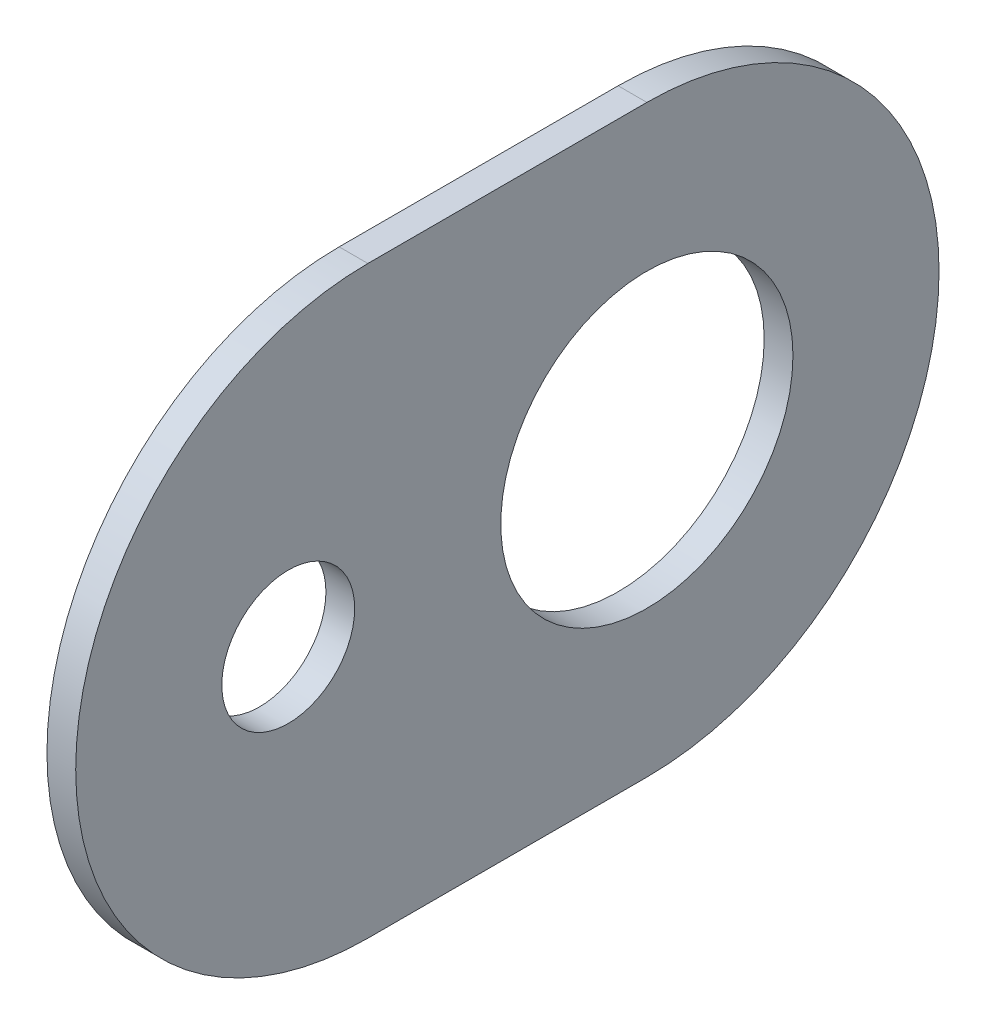
ISO-10303-21;
HEADER;
FILE_DESCRIPTION(('STEP AP214'),'2;1');
FILE_NAME('part.step','',(''),(''),'','','');
FILE_SCHEMA(('AUTOMOTIVE_DESIGN { 1 0 10303 214 1 1 1 1 }'));
ENDSEC;
DATA;
#1=APPLICATION_CONTEXT('core data for automotive mechanical design processes');
#2=APPLICATION_PROTOCOL_DEFINITION('international standard','automotive_design',2000,#1);
#3=PRODUCT_CONTEXT('',#1,'mechanical');
#4=PRODUCT('Part','Part','',(#3));
#5=PRODUCT_RELATED_PRODUCT_CATEGORY('part','',(#4));
#6=PRODUCT_DEFINITION_FORMATION('','',#4);
#7=PRODUCT_DEFINITION_CONTEXT('part definition',#1,'design');
#8=PRODUCT_DEFINITION('design','',#6,#7);
#9=PRODUCT_DEFINITION_SHAPE('','',#8);
#10=(LENGTH_UNIT() NAMED_UNIT(*) SI_UNIT(.MILLI.,.METRE.));
#11=(NAMED_UNIT(*) PLANE_ANGLE_UNIT() SI_UNIT($,.RADIAN.));
#12=(NAMED_UNIT(*) SI_UNIT($,.STERADIAN.) SOLID_ANGLE_UNIT());
#13=UNCERTAINTY_MEASURE_WITH_UNIT(LENGTH_MEASURE(1.E-05),#10,'distance_accuracy_value','');
#14=(GEOMETRIC_REPRESENTATION_CONTEXT(3) GLOBAL_UNCERTAINTY_ASSIGNED_CONTEXT((#13)) GLOBAL_UNIT_ASSIGNED_CONTEXT((#10,
#11,#12)) REPRESENTATION_CONTEXT('',''));
#15=CARTESIAN_POINT('',(0.,0.,0.));
#16=DIRECTION('',(0.,0.,1.));
#17=DIRECTION('',(1.,0.,0.));
#18=AXIS2_PLACEMENT_3D('',#15,#16,#17);
#19=CARTESIAN_POINT('',(2.5,25.3999999365,0.));
#20=DIRECTION('',(0.,-1.,0.));
#21=DIRECTION('',(0.,0.,-1.));
#22=AXIS2_PLACEMENT_3D('',#19,#20,#21);
#23=PLANE('',#22);
#24=DIRECTION('',(0.,0.,1.));
#25=VECTOR('',#24,1.);
#26=CARTESIAN_POINT('',(0.,25.3999999365,0.));
#27=LINE('',#26,#25);
#28=CARTESIAN_POINT('',(0.,25.3999999365,-12.12597266825));
#29=VERTEX_POINT('',#28);
#30=CARTESIAN_POINT('',(0.,25.3999999365,12.12597266825));
#31=VERTEX_POINT('',#30);
#32=EDGE_CURVE('E120',#29,#31,#27,.T.);
#33=ORIENTED_EDGE('',*,*,#32,.T.);
#34=DIRECTION('',(-1.,0.,0.));
#35=VECTOR('',#34,1.);
#36=CARTESIAN_POINT('',(2.5,25.3999999365,12.12597266825));
#37=LINE('',#36,#35);
#38=CARTESIAN_POINT('',(2.5,25.3999999365,12.12597266825));
#39=VERTEX_POINT('',#38);
#40=EDGE_CURVE('E12',#39,#31,#37,.T.);
#41=ORIENTED_EDGE('',*,*,#40,.F.);
#42=DIRECTION('',(0.,0.,1.));
#43=VECTOR('',#42,1.);
#44=CARTESIAN_POINT('',(2.5,25.3999999365,0.));
#45=LINE('',#44,#43);
#46=CARTESIAN_POINT('',(2.5,25.3999999365,-12.12597266825));
#47=VERTEX_POINT('',#46);
#48=EDGE_CURVE('E97',#47,#39,#45,.T.);
#49=ORIENTED_EDGE('',*,*,#48,.F.);
#50=DIRECTION('',(-1.,0.,0.));
#51=VECTOR('',#50,1.);
#52=CARTESIAN_POINT('',(2.5,25.3999999365,-12.12597266825));
#53=LINE('',#52,#51);
#54=EDGE_CURVE('E108',#47,#29,#53,.T.);
#55=ORIENTED_EDGE('',*,*,#54,.T.);
#56=EDGE_LOOP('',(#33,#41,#49,#55));
#57=FACE_BOUND('',#56,.T.);
#58=ADVANCED_FACE('F47',(#57),#23,.F.);
#59=CARTESIAN_POINT('',(2.5,0.,12.12597266825));
#60=DIRECTION('',(-1.,0.,0.));
#61=DIRECTION('',(0.,0.,1.));
#62=AXIS2_PLACEMENT_3D('',#59,#60,#61);
#63=CYLINDRICAL_SURFACE('',#62,25.3999999365);
#64=CARTESIAN_POINT('',(0.,0.,12.12597266825));
#65=DIRECTION('',(1.,0.,0.));
#66=DIRECTION('',(0.,0.,-1.));
#67=AXIS2_PLACEMENT_3D('',#64,#65,#66);
#68=CIRCLE('',#67,25.3999999365);
#69=CARTESIAN_POINT('',(0.,-25.3999999365,12.12597266825));
#70=VERTEX_POINT('',#69);
#71=EDGE_CURVE('E105',#31,#70,#68,.T.);
#72=ORIENTED_EDGE('',*,*,#71,.T.);
#73=DIRECTION('',(-1.,0.,0.));
#74=VECTOR('',#73,1.);
#75=CARTESIAN_POINT('',(2.5,-25.3999999365,12.12597266825));
#76=LINE('',#75,#74);
#77=CARTESIAN_POINT('',(2.5,-25.3999999365,12.12597266825));
#78=VERTEX_POINT('',#77);
#79=EDGE_CURVE('E59',#78,#70,#76,.T.);
#80=ORIENTED_EDGE('',*,*,#79,.F.);
#81=CARTESIAN_POINT('',(2.5,0.,12.12597266825));
#82=DIRECTION('',(1.,0.,0.));
#83=DIRECTION('',(0.,0.,-1.));
#84=AXIS2_PLACEMENT_3D('',#81,#82,#83);
#85=CIRCLE('',#84,25.3999999365);
#86=EDGE_CURVE('E95',#39,#78,#85,.T.);
#87=ORIENTED_EDGE('',*,*,#86,.F.);
#88=ORIENTED_EDGE('',*,*,#40,.T.);
#89=EDGE_LOOP('',(#72,#80,#87,#88));
#90=FACE_BOUND('',#89,.T.);
#91=ADVANCED_FACE('F103',(#90),#63,.T.);
#92=CARTESIAN_POINT('',(2.5,-25.3999999365,0.));
#93=DIRECTION('',(0.,-1.,0.));
#94=DIRECTION('',(0.,0.,-1.));
#95=AXIS2_PLACEMENT_3D('',#92,#93,#94);
#96=PLANE('',#95);
#97=DIRECTION('',(0.,0.,1.));
#98=VECTOR('',#97,1.);
#99=CARTESIAN_POINT('',(0.,-25.3999999365,0.));
#100=LINE('',#99,#98);
#101=CARTESIAN_POINT('',(0.,-25.3999999365,-12.12597266825));
#102=VERTEX_POINT('',#101);
#103=EDGE_CURVE('E122',#102,#70,#100,.T.);
#104=ORIENTED_EDGE('',*,*,#103,.F.);
#105=DIRECTION('',(-1.,0.,0.));
#106=VECTOR('',#105,1.);
#107=CARTESIAN_POINT('',(2.5,-25.3999999365,-12.12597266825));
#108=LINE('',#107,#106);
#109=CARTESIAN_POINT('',(2.5,-25.3999999365,-12.12597266825));
#110=VERTEX_POINT('',#109);
#111=EDGE_CURVE('E82',#110,#102,#108,.T.);
#112=ORIENTED_EDGE('',*,*,#111,.F.);
#113=DIRECTION('',(0.,0.,1.));
#114=VECTOR('',#113,1.);
#115=CARTESIAN_POINT('',(2.5,-25.3999999365,0.));
#116=LINE('',#115,#114);
#117=EDGE_CURVE('E92',#110,#78,#116,.T.);
#118=ORIENTED_EDGE('',*,*,#117,.T.);
#119=ORIENTED_EDGE('',*,*,#79,.T.);
#120=EDGE_LOOP('',(#104,#112,#118,#119));
#121=FACE_BOUND('',#120,.T.);
#122=ADVANCED_FACE('F106',(#121),#96,.T.);
#123=CARTESIAN_POINT('',(2.5,0.,19.04999996825));
#124=DIRECTION('',(-1.,0.,0.));
#125=DIRECTION('',(0.,0.,1.));
#126=AXIS2_PLACEMENT_3D('',#123,#124,#125);
#127=CYLINDRICAL_SURFACE('',#126,5.7759727);
#128=CARTESIAN_POINT('',(2.5,0.,19.04999996825));
#129=DIRECTION('',(1.,0.,0.));
#130=DIRECTION('',(0.,0.,-1.));
#131=AXIS2_PLACEMENT_3D('',#128,#129,#130);
#132=CIRCLE('',#131,5.7759727);
#133=CARTESIAN_POINT('',(2.5,0.,13.27402726825));
#134=VERTEX_POINT('',#133);
#135=EDGE_CURVE('E159',#134,#134,#132,.T.);
#136=ORIENTED_EDGE('',*,*,#135,.T.);
#137=EDGE_LOOP('',(#136));
#138=FACE_BOUND('',#137,.T.);
#139=CARTESIAN_POINT('',(0.,0.,19.04999996825));
#140=DIRECTION('',(1.,0.,0.));
#141=DIRECTION('',(0.,0.,-1.));
#142=AXIS2_PLACEMENT_3D('',#139,#140,#141);
#143=CIRCLE('',#142,5.7759727);
#144=CARTESIAN_POINT('',(0.,0.,13.27402726825));
#145=VERTEX_POINT('',#144);
#146=EDGE_CURVE('E112',#145,#145,#143,.T.);
#147=ORIENTED_EDGE('',*,*,#146,.F.);
#148=EDGE_LOOP('',(#147));
#149=FACE_BOUND('',#148,.T.);
#150=ADVANCED_FACE('F149',(#138,#149),#127,.F.);
#151=CARTESIAN_POINT('',(2.5,0.,-12.12597266825));
#152=DIRECTION('',(-1.,0.,0.));
#153=DIRECTION('',(0.,0.,1.));
#154=AXIS2_PLACEMENT_3D('',#151,#152,#153);
#155=CYLINDRICAL_SURFACE('',#154,12.7);
#156=CARTESIAN_POINT('',(2.5,0.,-12.12597266825));
#157=DIRECTION('',(1.,0.,0.));
#158=DIRECTION('',(0.,0.,-1.));
#159=AXIS2_PLACEMENT_3D('',#156,#157,#158);
#160=CIRCLE('',#159,12.7);
#161=CARTESIAN_POINT('',(2.5,0.,-24.82597266825));
#162=VERTEX_POINT('',#161);
#163=EDGE_CURVE('E121',#162,#162,#160,.T.);
#164=ORIENTED_EDGE('',*,*,#163,.T.);
#165=EDGE_LOOP('',(#164));
#166=FACE_BOUND('',#165,.T.);
#167=CARTESIAN_POINT('',(0.,0.,-12.12597266825));
#168=DIRECTION('',(1.,0.,0.));
#169=DIRECTION('',(0.,0.,-1.));
#170=AXIS2_PLACEMENT_3D('',#167,#168,#169);
#171=CIRCLE('',#170,12.7);
#172=CARTESIAN_POINT('',(0.,0.,-24.82597266825));
#173=VERTEX_POINT('',#172);
#174=EDGE_CURVE('E111',#173,#173,#171,.T.);
#175=ORIENTED_EDGE('',*,*,#174,.F.);
#176=EDGE_LOOP('',(#175));
#177=FACE_BOUND('',#176,.T.);
#178=ADVANCED_FACE('F51',(#166,#177),#155,.F.);
#179=CARTESIAN_POINT('',(2.5,0.,-12.12597266825));
#180=DIRECTION('',(-1.,0.,0.));
#181=DIRECTION('',(0.,0.,1.));
#182=AXIS2_PLACEMENT_3D('',#179,#180,#181);
#183=CYLINDRICAL_SURFACE('',#182,25.3999999365);
#184=CARTESIAN_POINT('',(0.,0.,-12.12597266825));
#185=DIRECTION('',(1.,0.,0.));
#186=DIRECTION('',(0.,0.,-1.));
#187=AXIS2_PLACEMENT_3D('',#184,#185,#186);
#188=CIRCLE('',#187,25.3999999365);
#189=EDGE_CURVE('E85',#102,#29,#188,.T.);
#190=ORIENTED_EDGE('',*,*,#189,.T.);
#191=ORIENTED_EDGE('',*,*,#54,.F.);
#192=CARTESIAN_POINT('',(2.5,0.,-12.12597266825));
#193=DIRECTION('',(1.,0.,0.));
#194=DIRECTION('',(0.,0.,-1.));
#195=AXIS2_PLACEMENT_3D('',#192,#193,#194);
#196=CIRCLE('',#195,25.3999999365);
#197=EDGE_CURVE('E68',#110,#47,#196,.T.);
#198=ORIENTED_EDGE('',*,*,#197,.F.);
#199=ORIENTED_EDGE('',*,*,#111,.T.);
#200=EDGE_LOOP('',(#190,#191,#198,#199));
#201=FACE_BOUND('',#200,.T.);
#202=ADVANCED_FACE('F138',(#201),#183,.T.);
#203=CARTESIAN_POINT('',(2.5,0.,0.));
#204=DIRECTION('',(1.,0.,0.));
#205=DIRECTION('',(0.,0.,-1.));
#206=AXIS2_PLACEMENT_3D('',#203,#204,#205);
#207=PLANE('',#206);
#208=ORIENTED_EDGE('',*,*,#163,.F.);
#209=EDGE_LOOP('',(#208));
#210=FACE_BOUND('',#209,.T.);
#211=ORIENTED_EDGE('',*,*,#135,.F.);
#212=EDGE_LOOP('',(#211));
#213=FACE_BOUND('',#212,.T.);
#214=ORIENTED_EDGE('',*,*,#48,.T.);
#215=ORIENTED_EDGE('',*,*,#86,.T.);
#216=ORIENTED_EDGE('',*,*,#117,.F.);
#217=ORIENTED_EDGE('',*,*,#197,.T.);
#218=EDGE_LOOP('',(#214,#215,#216,#217));
#219=FACE_BOUND('',#218,.T.);
#220=ADVANCED_FACE('F91',(#210,#213,#219),#207,.T.);
#221=CARTESIAN_POINT('',(0.,0.,0.));
#222=DIRECTION('',(1.,0.,0.));
#223=DIRECTION('',(0.,0.,-1.));
#224=AXIS2_PLACEMENT_3D('',#221,#222,#223);
#225=PLANE('',#224);
#226=ORIENTED_EDGE('',*,*,#174,.T.);
#227=EDGE_LOOP('',(#226));
#228=FACE_BOUND('',#227,.T.);
#229=ORIENTED_EDGE('',*,*,#146,.T.);
#230=EDGE_LOOP('',(#229));
#231=FACE_BOUND('',#230,.T.);
#232=ORIENTED_EDGE('',*,*,#32,.F.);
#233=ORIENTED_EDGE('',*,*,#189,.F.);
#234=ORIENTED_EDGE('',*,*,#103,.T.);
#235=ORIENTED_EDGE('',*,*,#71,.F.);
#236=EDGE_LOOP('',(#232,#233,#234,#235));
#237=FACE_BOUND('',#236,.T.);
#238=ADVANCED_FACE('F128',(#228,#231,#237),#225,.F.);
#239=CLOSED_SHELL('',(#58,#91,#122,#150,#178,#202,#220,#238));
#240=MANIFOLD_SOLID_BREP('B2',#239);
#241=ADVANCED_BREP_SHAPE_REPRESENTATION('',(#18,#240),#14);
#242=SHAPE_DEFINITION_REPRESENTATION(#9,#241);
ENDSEC;
END-ISO-10303-21;
